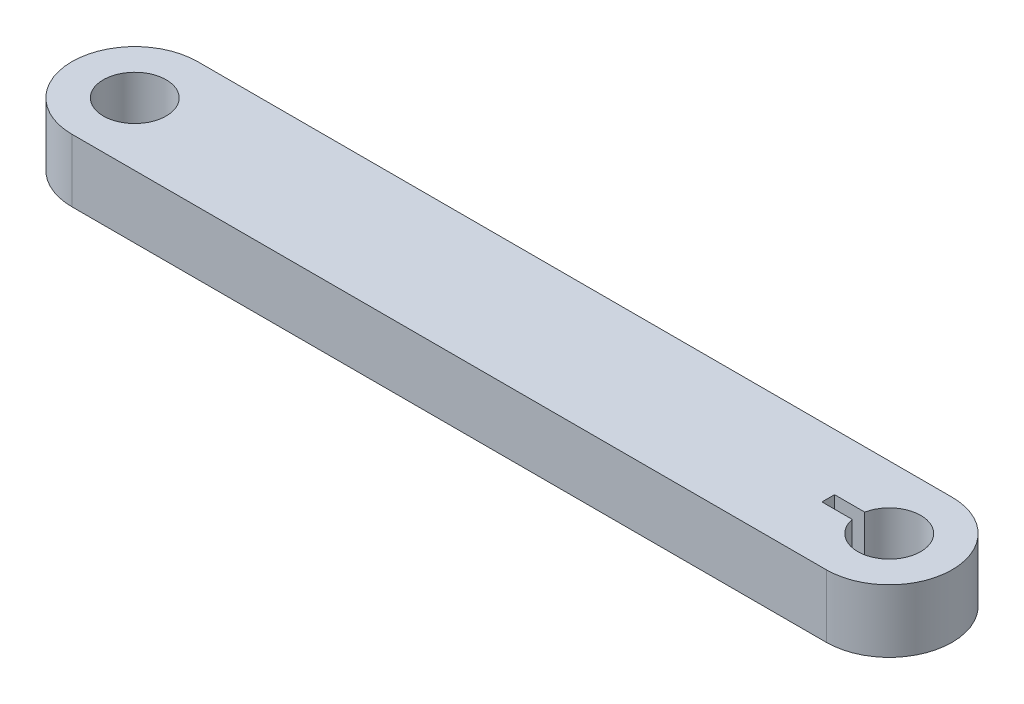
ISO-10303-21;
HEADER;
FILE_DESCRIPTION(('STEP AP214'),'2;1');
FILE_NAME('part.step','',(''),(''),'','','');
FILE_SCHEMA(('AUTOMOTIVE_DESIGN { 1 0 10303 214 1 1 1 1 }'));
ENDSEC;
DATA;
#1=APPLICATION_CONTEXT('core data for automotive mechanical design processes');
#2=APPLICATION_PROTOCOL_DEFINITION('international standard','automotive_design',2000,#1);
#3=PRODUCT_CONTEXT('',#1,'mechanical');
#4=PRODUCT('Part','Part','',(#3));
#5=PRODUCT_RELATED_PRODUCT_CATEGORY('part','',(#4));
#6=PRODUCT_DEFINITION_FORMATION('','',#4);
#7=PRODUCT_DEFINITION_CONTEXT('part definition',#1,'design');
#8=PRODUCT_DEFINITION('design','',#6,#7);
#9=PRODUCT_DEFINITION_SHAPE('','',#8);
#10=(LENGTH_UNIT() NAMED_UNIT(*) SI_UNIT(.MILLI.,.METRE.));
#11=(NAMED_UNIT(*) PLANE_ANGLE_UNIT() SI_UNIT($,.RADIAN.));
#12=(NAMED_UNIT(*) SI_UNIT($,.STERADIAN.) SOLID_ANGLE_UNIT());
#13=UNCERTAINTY_MEASURE_WITH_UNIT(LENGTH_MEASURE(1.E-05),#10,'distance_accuracy_value','');
#14=(GEOMETRIC_REPRESENTATION_CONTEXT(3) GLOBAL_UNCERTAINTY_ASSIGNED_CONTEXT((#13)) GLOBAL_UNIT_ASSIGNED_CONTEXT((#10,
#11,#12)) REPRESENTATION_CONTEXT('',''));
#15=CARTESIAN_POINT('',(0.,0.,0.));
#16=DIRECTION('',(0.,0.,1.));
#17=DIRECTION('',(1.,0.,0.));
#18=AXIS2_PLACEMENT_3D('',#15,#16,#17);
#19=CARTESIAN_POINT('',(0.,6.35,0.));
#20=DIRECTION('',(0.,-1.,0.));
#21=DIRECTION('',(0.,0.,-1.));
#22=AXIS2_PLACEMENT_3D('',#19,#20,#21);
#23=CYLINDRICAL_SURFACE('',#22,6.35);
#24=CARTESIAN_POINT('',(0.,0.,0.));
#25=DIRECTION('',(0.,1.,0.));
#26=DIRECTION('',(0.,0.,1.));
#27=AXIS2_PLACEMENT_3D('',#24,#25,#26);
#28=CIRCLE('',#27,6.35);
#29=CARTESIAN_POINT('',(0.,0.,6.35));
#30=VERTEX_POINT('',#29);
#31=CARTESIAN_POINT('',(0.,0.,-6.35));
#32=VERTEX_POINT('',#31);
#33=EDGE_CURVE('E155',#30,#32,#28,.T.);
#34=ORIENTED_EDGE('',*,*,#33,.T.);
#35=DIRECTION('',(0.,-1.,0.));
#36=VECTOR('',#35,1.);
#37=CARTESIAN_POINT('',(0.,6.35,-6.35));
#38=LINE('',#37,#36);
#39=CARTESIAN_POINT('',(0.,6.35,-6.35));
#40=VERTEX_POINT('',#39);
#41=EDGE_CURVE('E11',#40,#32,#38,.T.);
#42=ORIENTED_EDGE('',*,*,#41,.F.);
#43=CARTESIAN_POINT('',(0.,6.35,0.));
#44=DIRECTION('',(0.,1.,0.));
#45=DIRECTION('',(0.,0.,1.));
#46=AXIS2_PLACEMENT_3D('',#43,#44,#45);
#47=CIRCLE('',#46,6.35);
#48=CARTESIAN_POINT('',(0.,6.35,6.35));
#49=VERTEX_POINT('',#48);
#50=EDGE_CURVE('E161',#49,#40,#47,.T.);
#51=ORIENTED_EDGE('',*,*,#50,.F.);
#52=DIRECTION('',(0.,-1.,0.));
#53=VECTOR('',#52,1.);
#54=CARTESIAN_POINT('',(0.,6.35,6.35));
#55=LINE('',#54,#53);
#56=EDGE_CURVE('E175',#49,#30,#55,.T.);
#57=ORIENTED_EDGE('',*,*,#56,.T.);
#58=EDGE_LOOP('',(#34,#42,#51,#57));
#59=FACE_BOUND('',#58,.T.);
#60=ADVANCED_FACE('F43',(#59),#23,.T.);
#61=CARTESIAN_POINT('',(0.,6.35,-6.35));
#62=DIRECTION('',(0.,0.,1.));
#63=DIRECTION('',(1.,0.,0.));
#64=AXIS2_PLACEMENT_3D('',#61,#62,#63);
#65=PLANE('',#64);
#66=DIRECTION('',(-1.,0.,0.));
#67=VECTOR('',#66,1.);
#68=CARTESIAN_POINT('',(0.,0.,-6.35));
#69=LINE('',#68,#67);
#70=CARTESIAN_POINT('',(-76.2,0.,-6.35));
#71=VERTEX_POINT('',#70);
#72=EDGE_CURVE('E179',#32,#71,#69,.T.);
#73=ORIENTED_EDGE('',*,*,#72,.T.);
#74=DIRECTION('',(0.,-1.,0.));
#75=VECTOR('',#74,1.);
#76=CARTESIAN_POINT('',(-76.2,6.35,-6.35));
#77=LINE('',#76,#75);
#78=CARTESIAN_POINT('',(-76.2,6.35,-6.35));
#79=VERTEX_POINT('',#78);
#80=EDGE_CURVE('E51',#79,#71,#77,.T.);
#81=ORIENTED_EDGE('',*,*,#80,.F.);
#82=DIRECTION('',(-1.,0.,0.));
#83=VECTOR('',#82,1.);
#84=CARTESIAN_POINT('',(0.,6.35,-6.35));
#85=LINE('',#84,#83);
#86=EDGE_CURVE('E165',#40,#79,#85,.T.);
#87=ORIENTED_EDGE('',*,*,#86,.F.);
#88=ORIENTED_EDGE('',*,*,#41,.T.);
#89=EDGE_LOOP('',(#73,#81,#87,#88));
#90=FACE_BOUND('',#89,.T.);
#91=ADVANCED_FACE('F213',(#90),#65,.F.);
#92=CARTESIAN_POINT('',(-76.2,6.35,0.));
#93=DIRECTION('',(0.,-1.,0.));
#94=DIRECTION('',(0.,0.,-1.));
#95=AXIS2_PLACEMENT_3D('',#92,#93,#94);
#96=CYLINDRICAL_SURFACE('',#95,6.35);
#97=CARTESIAN_POINT('',(-76.2,0.,0.));
#98=DIRECTION('',(0.,1.,0.));
#99=DIRECTION('',(0.,0.,1.));
#100=AXIS2_PLACEMENT_3D('',#97,#98,#99);
#101=CIRCLE('',#100,6.35);
#102=CARTESIAN_POINT('',(-76.2,0.,6.35000000000001));
#103=VERTEX_POINT('',#102);
#104=EDGE_CURVE('E182',#71,#103,#101,.T.);
#105=ORIENTED_EDGE('',*,*,#104,.T.);
#106=DIRECTION('',(0.,-1.,0.));
#107=VECTOR('',#106,1.);
#108=CARTESIAN_POINT('',(-76.2,6.35,6.35000000000001));
#109=LINE('',#108,#107);
#110=CARTESIAN_POINT('',(-76.2,6.35,6.35000000000001));
#111=VERTEX_POINT('',#110);
#112=EDGE_CURVE('E190',#111,#103,#109,.T.);
#113=ORIENTED_EDGE('',*,*,#112,.F.);
#114=CARTESIAN_POINT('',(-76.2,6.35,0.));
#115=DIRECTION('',(0.,1.,0.));
#116=DIRECTION('',(0.,0.,1.));
#117=AXIS2_PLACEMENT_3D('',#114,#115,#116);
#118=CIRCLE('',#117,6.35);
#119=EDGE_CURVE('E169',#79,#111,#118,.T.);
#120=ORIENTED_EDGE('',*,*,#119,.F.);
#121=ORIENTED_EDGE('',*,*,#80,.T.);
#122=EDGE_LOOP('',(#105,#113,#120,#121));
#123=FACE_BOUND('',#122,.T.);
#124=ADVANCED_FACE('F199',(#123),#96,.T.);
#125=CARTESIAN_POINT('',(0.,6.35,6.35));
#126=DIRECTION('',(0.,0.,-1.));
#127=DIRECTION('',(-1.,0.,0.));
#128=AXIS2_PLACEMENT_3D('',#125,#126,#127);
#129=PLANE('',#128);
#130=DIRECTION('',(1.,0.,0.));
#131=VECTOR('',#130,1.);
#132=CARTESIAN_POINT('',(0.,0.,6.35));
#133=LINE('',#132,#131);
#134=EDGE_CURVE('E166',#103,#30,#133,.T.);
#135=ORIENTED_EDGE('',*,*,#134,.T.);
#136=ORIENTED_EDGE('',*,*,#56,.F.);
#137=DIRECTION('',(1.,0.,0.));
#138=VECTOR('',#137,1.);
#139=CARTESIAN_POINT('',(0.,6.35,6.35));
#140=LINE('',#139,#138);
#141=EDGE_CURVE('E172',#111,#49,#140,.T.);
#142=ORIENTED_EDGE('',*,*,#141,.F.);
#143=ORIENTED_EDGE('',*,*,#112,.T.);
#144=EDGE_LOOP('',(#135,#136,#142,#143));
#145=FACE_BOUND('',#144,.T.);
#146=ADVANCED_FACE('F206',(#145),#129,.F.);
#147=CARTESIAN_POINT('',(0.,6.35,0.));
#148=DIRECTION('',(0.,1.,0.));
#149=DIRECTION('',(0.,0.,1.));
#150=AXIS2_PLACEMENT_3D('',#147,#148,#149);
#151=PLANE('',#150);
#152=CARTESIAN_POINT('',(-76.2,6.35,0.));
#153=DIRECTION('',(0.,1.,0.));
#154=DIRECTION('',(0.,0.,1.));
#155=AXIS2_PLACEMENT_3D('',#152,#153,#154);
#156=CIRCLE('',#155,3.175);
#157=CARTESIAN_POINT('',(-76.2,6.35,3.175));
#158=VERTEX_POINT('',#157);
#159=EDGE_CURVE('E136',#158,#158,#156,.T.);
#160=ORIENTED_EDGE('',*,*,#159,.F.);
#161=EDGE_LOOP('',(#160));
#162=FACE_BOUND('',#161,.T.);
#163=CARTESIAN_POINT('',(0.,6.35,0.));
#164=DIRECTION('',(0.,1.,0.));
#165=DIRECTION('',(0.,0.,1.));
#166=AXIS2_PLACEMENT_3D('',#163,#164,#165);
#167=CIRCLE('',#166,3.175);
#168=CARTESIAN_POINT('',(-3.11085197333464,6.35,0.635));
#169=VERTEX_POINT('',#168);
#170=CARTESIAN_POINT('',(-3.11085197333464,6.35,-0.635));
#171=VERTEX_POINT('',#170);
#172=EDGE_CURVE('E58',#169,#171,#167,.T.);
#173=ORIENTED_EDGE('',*,*,#172,.F.);
#174=DIRECTION('',(1.,0.,0.));
#175=VECTOR('',#174,1.);
#176=CARTESIAN_POINT('',(-3.11085197333464,6.35,0.635));
#177=LINE('',#176,#175);
#178=CARTESIAN_POINT('',(-6.15885197333464,6.35,0.635));
#179=VERTEX_POINT('',#178);
#180=EDGE_CURVE('E129',#179,#169,#177,.T.);
#181=ORIENTED_EDGE('',*,*,#180,.F.);
#182=DIRECTION('',(0.,0.,1.));
#183=VECTOR('',#182,1.);
#184=CARTESIAN_POINT('',(-6.15885197333464,6.35,-0.635));
#185=LINE('',#184,#183);
#186=CARTESIAN_POINT('',(-6.15885197333464,6.35,-0.635));
#187=VERTEX_POINT('',#186);
#188=EDGE_CURVE('E133',#187,#179,#185,.T.);
#189=ORIENTED_EDGE('',*,*,#188,.F.);
#190=DIRECTION('',(-1.,0.,0.));
#191=VECTOR('',#190,1.);
#192=CARTESIAN_POINT('',(-3.11085197333464,6.35,-0.635));
#193=LINE('',#192,#191);
#194=EDGE_CURVE('E145',#171,#187,#193,.T.);
#195=ORIENTED_EDGE('',*,*,#194,.F.);
#196=EDGE_LOOP('',(#173,#181,#189,#195));
#197=FACE_BOUND('',#196,.T.);
#198=ORIENTED_EDGE('',*,*,#50,.T.);
#199=ORIENTED_EDGE('',*,*,#86,.T.);
#200=ORIENTED_EDGE('',*,*,#119,.T.);
#201=ORIENTED_EDGE('',*,*,#141,.T.);
#202=EDGE_LOOP('',(#198,#199,#200,#201));
#203=FACE_BOUND('',#202,.T.);
#204=ADVANCED_FACE('F212',(#162,#197,#203),#151,.T.);
#205=CARTESIAN_POINT('',(0.,0.,0.));
#206=DIRECTION('',(0.,1.,0.));
#207=DIRECTION('',(0.,0.,1.));
#208=AXIS2_PLACEMENT_3D('',#205,#206,#207);
#209=PLANE('',#208);
#210=CARTESIAN_POINT('',(-76.2,0.,0.));
#211=DIRECTION('',(0.,1.,0.));
#212=DIRECTION('',(0.,0.,1.));
#213=AXIS2_PLACEMENT_3D('',#210,#211,#212);
#214=CIRCLE('',#213,3.175);
#215=CARTESIAN_POINT('',(-76.2,0.,3.175));
#216=VERTEX_POINT('',#215);
#217=EDGE_CURVE('E146',#216,#216,#214,.T.);
#218=ORIENTED_EDGE('',*,*,#217,.T.);
#219=EDGE_LOOP('',(#218));
#220=FACE_BOUND('',#219,.T.);
#221=DIRECTION('',(1.,0.,0.));
#222=VECTOR('',#221,1.);
#223=CARTESIAN_POINT('',(-3.11085197333464,0.,0.635));
#224=LINE('',#223,#222);
#225=CARTESIAN_POINT('',(-6.15885197333464,0.,0.635));
#226=VERTEX_POINT('',#225);
#227=CARTESIAN_POINT('',(-3.11085197333464,0.,0.635));
#228=VERTEX_POINT('',#227);
#229=EDGE_CURVE('E117',#226,#228,#224,.T.);
#230=ORIENTED_EDGE('',*,*,#229,.T.);
#231=CARTESIAN_POINT('',(0.,0.,0.));
#232=DIRECTION('',(0.,1.,0.));
#233=DIRECTION('',(0.,0.,1.));
#234=AXIS2_PLACEMENT_3D('',#231,#232,#233);
#235=CIRCLE('',#234,3.175);
#236=CARTESIAN_POINT('',(-3.11085197333464,0.,-0.635));
#237=VERTEX_POINT('',#236);
#238=EDGE_CURVE('E110',#228,#237,#235,.T.);
#239=ORIENTED_EDGE('',*,*,#238,.T.);
#240=DIRECTION('',(-1.,0.,0.));
#241=VECTOR('',#240,1.);
#242=CARTESIAN_POINT('',(-3.11085197333464,0.,-0.635));
#243=LINE('',#242,#241);
#244=CARTESIAN_POINT('',(-6.15885197333464,0.,-0.635));
#245=VERTEX_POINT('',#244);
#246=EDGE_CURVE('E120',#237,#245,#243,.T.);
#247=ORIENTED_EDGE('',*,*,#246,.T.);
#248=DIRECTION('',(0.,0.,1.));
#249=VECTOR('',#248,1.);
#250=CARTESIAN_POINT('',(-6.15885197333464,0.,-0.635));
#251=LINE('',#250,#249);
#252=EDGE_CURVE('E66',#245,#226,#251,.T.);
#253=ORIENTED_EDGE('',*,*,#252,.T.);
#254=EDGE_LOOP('',(#230,#239,#247,#253));
#255=FACE_BOUND('',#254,.T.);
#256=ORIENTED_EDGE('',*,*,#33,.F.);
#257=ORIENTED_EDGE('',*,*,#134,.F.);
#258=ORIENTED_EDGE('',*,*,#104,.F.);
#259=ORIENTED_EDGE('',*,*,#72,.F.);
#260=EDGE_LOOP('',(#256,#257,#258,#259));
#261=FACE_BOUND('',#260,.T.);
#262=ADVANCED_FACE('F125',(#220,#255,#261),#209,.F.);
#263=CARTESIAN_POINT('',(0.,0.,0.));
#264=DIRECTION('',(0.,1.,0.));
#265=DIRECTION('',(0.,0.,1.));
#266=AXIS2_PLACEMENT_3D('',#263,#264,#265);
#267=CYLINDRICAL_SURFACE('',#266,3.175);
#268=ORIENTED_EDGE('',*,*,#172,.T.);
#269=DIRECTION('',(0.,1.,0.));
#270=VECTOR('',#269,1.);
#271=CARTESIAN_POINT('',(-3.11085197333464,0.,-0.635));
#272=LINE('',#271,#270);
#273=EDGE_CURVE('E106',#237,#171,#272,.T.);
#274=ORIENTED_EDGE('',*,*,#273,.F.);
#275=ORIENTED_EDGE('',*,*,#238,.F.);
#276=DIRECTION('',(0.,1.,0.));
#277=VECTOR('',#276,1.);
#278=CARTESIAN_POINT('',(-3.11085197333464,0.,0.635));
#279=LINE('',#278,#277);
#280=EDGE_CURVE('E152',#228,#169,#279,.T.);
#281=ORIENTED_EDGE('',*,*,#280,.T.);
#282=EDGE_LOOP('',(#268,#274,#275,#281));
#283=FACE_BOUND('',#282,.T.);
#284=ADVANCED_FACE('F108',(#283),#267,.F.);
#285=CARTESIAN_POINT('',(-3.11085197333464,0.,0.635));
#286=DIRECTION('',(0.,0.,1.));
#287=DIRECTION('',(1.,0.,0.));
#288=AXIS2_PLACEMENT_3D('',#285,#286,#287);
#289=PLANE('',#288);
#290=ORIENTED_EDGE('',*,*,#180,.T.);
#291=ORIENTED_EDGE('',*,*,#280,.F.);
#292=ORIENTED_EDGE('',*,*,#229,.F.);
#293=DIRECTION('',(0.,1.,0.));
#294=VECTOR('',#293,1.);
#295=CARTESIAN_POINT('',(-6.15885197333464,0.,0.635));
#296=LINE('',#295,#294);
#297=EDGE_CURVE('E156',#226,#179,#296,.T.);
#298=ORIENTED_EDGE('',*,*,#297,.T.);
#299=EDGE_LOOP('',(#290,#291,#292,#298));
#300=FACE_BOUND('',#299,.T.);
#301=ADVANCED_FACE('F231',(#300),#289,.F.);
#302=CARTESIAN_POINT('',(-6.15885197333464,0.,-0.635));
#303=DIRECTION('',(-1.,0.,0.));
#304=DIRECTION('',(0.,0.,1.));
#305=AXIS2_PLACEMENT_3D('',#302,#303,#304);
#306=PLANE('',#305);
#307=ORIENTED_EDGE('',*,*,#188,.T.);
#308=ORIENTED_EDGE('',*,*,#297,.F.);
#309=ORIENTED_EDGE('',*,*,#252,.F.);
#310=DIRECTION('',(0.,1.,0.));
#311=VECTOR('',#310,1.);
#312=CARTESIAN_POINT('',(-6.15885197333464,0.,-0.635));
#313=LINE('',#312,#311);
#314=EDGE_CURVE('E116',#245,#187,#313,.T.);
#315=ORIENTED_EDGE('',*,*,#314,.T.);
#316=EDGE_LOOP('',(#307,#308,#309,#315));
#317=FACE_BOUND('',#316,.T.);
#318=ADVANCED_FACE('F235',(#317),#306,.F.);
#319=CARTESIAN_POINT('',(-3.11085197333464,0.,-0.635));
#320=DIRECTION('',(0.,0.,-1.));
#321=DIRECTION('',(-1.,0.,0.));
#322=AXIS2_PLACEMENT_3D('',#319,#320,#321);
#323=PLANE('',#322);
#324=ORIENTED_EDGE('',*,*,#194,.T.);
#325=ORIENTED_EDGE('',*,*,#314,.F.);
#326=ORIENTED_EDGE('',*,*,#246,.F.);
#327=ORIENTED_EDGE('',*,*,#273,.T.);
#328=EDGE_LOOP('',(#324,#325,#326,#327));
#329=FACE_BOUND('',#328,.T.);
#330=ADVANCED_FACE('F121',(#329),#323,.F.);
#331=CARTESIAN_POINT('',(-76.2,0.,0.));
#332=DIRECTION('',(0.,1.,0.));
#333=DIRECTION('',(0.,0.,1.));
#334=AXIS2_PLACEMENT_3D('',#331,#332,#333);
#335=CYLINDRICAL_SURFACE('',#334,3.175);
#336=ORIENTED_EDGE('',*,*,#217,.F.);
#337=EDGE_LOOP('',(#336));
#338=FACE_BOUND('',#337,.T.);
#339=ORIENTED_EDGE('',*,*,#159,.T.);
#340=EDGE_LOOP('',(#339));
#341=FACE_BOUND('',#340,.T.);
#342=ADVANCED_FACE('F234',(#338,#341),#335,.F.);
#343=CLOSED_SHELL('',(#60,#91,#124,#146,#204,#262,#284,#301,#318,#330,#342));
#344=MANIFOLD_SOLID_BREP('B2',#343);
#345=ADVANCED_BREP_SHAPE_REPRESENTATION('',(#18,#344),#14);
#346=SHAPE_DEFINITION_REPRESENTATION(#9,#345);
ENDSEC;
END-ISO-10303-21;
